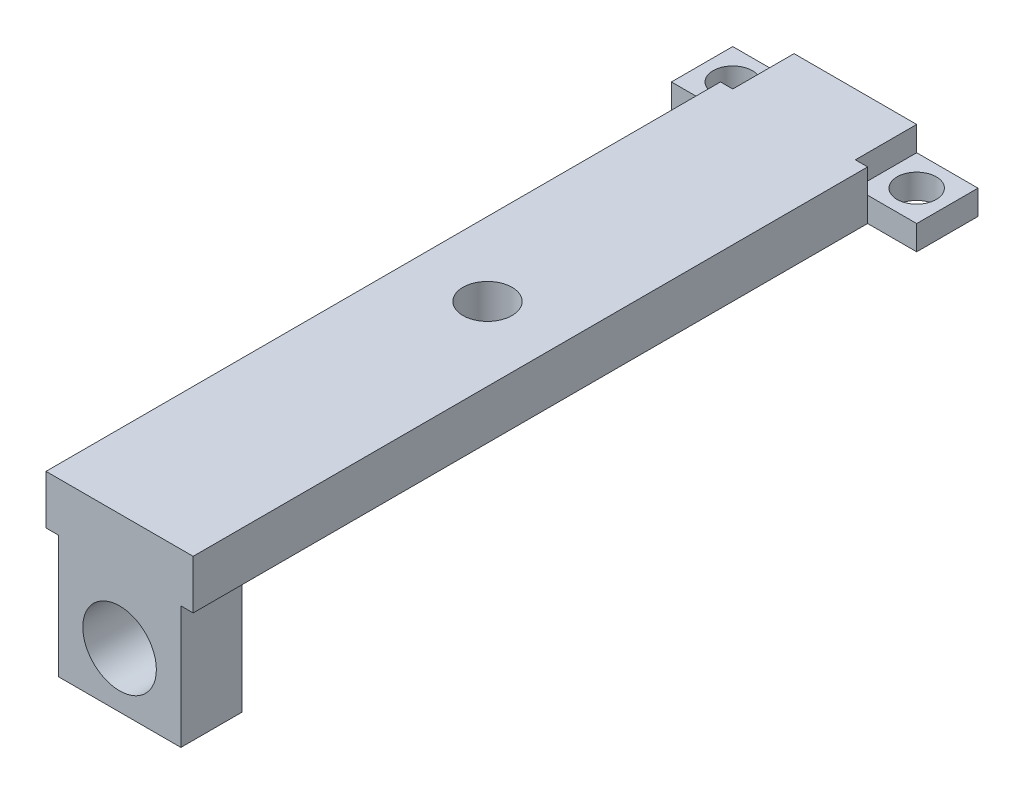
ISO-10303-21;
HEADER;
FILE_DESCRIPTION(('STEP AP214'),'2;1');
FILE_NAME('part.step','',(''),(''),'','','');
FILE_SCHEMA(('AUTOMOTIVE_DESIGN { 1 0 10303 214 1 1 1 1 }'));
ENDSEC;
DATA;
#1=APPLICATION_CONTEXT('core data for automotive mechanical design processes');
#2=APPLICATION_PROTOCOL_DEFINITION('international standard','automotive_design',2000,#1);
#3=PRODUCT_CONTEXT('',#1,'mechanical');
#4=PRODUCT('Part','Part','',(#3));
#5=PRODUCT_RELATED_PRODUCT_CATEGORY('part','',(#4));
#6=PRODUCT_DEFINITION_FORMATION('','',#4);
#7=PRODUCT_DEFINITION_CONTEXT('part definition',#1,'design');
#8=PRODUCT_DEFINITION('design','',#6,#7);
#9=PRODUCT_DEFINITION_SHAPE('','',#8);
#10=(LENGTH_UNIT() NAMED_UNIT(*) SI_UNIT(.MILLI.,.METRE.));
#11=(NAMED_UNIT(*) PLANE_ANGLE_UNIT() SI_UNIT($,.RADIAN.));
#12=(NAMED_UNIT(*) SI_UNIT($,.STERADIAN.) SOLID_ANGLE_UNIT());
#13=UNCERTAINTY_MEASURE_WITH_UNIT(LENGTH_MEASURE(1.E-05),#10,'distance_accuracy_value','');
#14=(GEOMETRIC_REPRESENTATION_CONTEXT(3) GLOBAL_UNCERTAINTY_ASSIGNED_CONTEXT((#13)) GLOBAL_UNIT_ASSIGNED_CONTEXT((#10,
#11,#12)) REPRESENTATION_CONTEXT('',''));
#15=CARTESIAN_POINT('',(0.,0.,0.));
#16=DIRECTION('',(0.,0.,1.));
#17=DIRECTION('',(1.,0.,0.));
#18=AXIS2_PLACEMENT_3D('',#15,#16,#17);
#19=CARTESIAN_POINT('',(-6.,4.,-30.));
#20=DIRECTION('',(1.,0.,0.));
#21=DIRECTION('',(0.,0.,-1.));
#22=AXIS2_PLACEMENT_3D('',#19,#20,#21);
#23=PLANE('',#22);
#24=DIRECTION('',(0.,-1.,0.));
#25=VECTOR('',#24,1.);
#26=CARTESIAN_POINT('',(-6.,4.001,-25.));
#27=LINE('',#26,#25);
#28=CARTESIAN_POINT('',(-6.,4.,-25.));
#29=VERTEX_POINT('',#28);
#30=CARTESIAN_POINT('',(-6.,2.,-25.));
#31=VERTEX_POINT('',#30);
#32=EDGE_CURVE('E190',#29,#31,#27,.T.);
#33=ORIENTED_EDGE('',*,*,#32,.T.);
#34=DIRECTION('',(0.,1.,0.));
#35=VECTOR('',#34,1.);
#36=CARTESIAN_POINT('',(-6.,4.,-25.));
#37=LINE('',#36,#35);
#38=CARTESIAN_POINT('',(-6.,0.,-25.));
#39=VERTEX_POINT('',#38);
#40=EDGE_CURVE('E240',#39,#31,#37,.T.);
#41=ORIENTED_EDGE('',*,*,#40,.F.);
#42=DIRECTION('',(0.,0.,1.));
#43=VECTOR('',#42,1.);
#44=CARTESIAN_POINT('',(-6.,0.,-30.));
#45=LINE('',#44,#43);
#46=CARTESIAN_POINT('',(-6.,0.,30.));
#47=VERTEX_POINT('',#46);
#48=EDGE_CURVE('E279',#39,#47,#45,.T.);
#49=ORIENTED_EDGE('',*,*,#48,.T.);
#50=DIRECTION('',(0.,-1.,0.));
#51=VECTOR('',#50,1.);
#52=CARTESIAN_POINT('',(-6.,4.,30.));
#53=LINE('',#52,#51);
#54=CARTESIAN_POINT('',(-6.,4.,30.));
#55=VERTEX_POINT('',#54);
#56=EDGE_CURVE('E11',#55,#47,#53,.T.);
#57=ORIENTED_EDGE('',*,*,#56,.F.);
#58=DIRECTION('',(0.,0.,1.));
#59=VECTOR('',#58,1.);
#60=CARTESIAN_POINT('',(-6.,4.,-30.));
#61=LINE('',#60,#59);
#62=EDGE_CURVE('E280',#29,#55,#61,.T.);
#63=ORIENTED_EDGE('',*,*,#62,.F.);
#64=EDGE_LOOP('',(#33,#41,#49,#57,#63));
#65=FACE_BOUND('',#64,.T.);
#66=ADVANCED_FACE('F33',(#65),#23,.F.);
#67=CARTESIAN_POINT('',(6.,4.,-30.));
#68=DIRECTION('',(0.,0.,1.));
#69=DIRECTION('',(1.,0.,0.));
#70=AXIS2_PLACEMENT_3D('',#67,#68,#69);
#71=PLANE('',#70);
#72=DIRECTION('',(-1.,0.,0.));
#73=VECTOR('',#72,1.);
#74=CARTESIAN_POINT('',(6.,4.,-30.));
#75=LINE('',#74,#73);
#76=CARTESIAN_POINT('',(5.,4.,-30.));
#77=VERTEX_POINT('',#76);
#78=CARTESIAN_POINT('',(-5.,4.,-30.));
#79=VERTEX_POINT('',#78);
#80=EDGE_CURVE('E179',#77,#79,#75,.T.);
#81=ORIENTED_EDGE('',*,*,#80,.F.);
#82=DIRECTION('',(0.,-1.,0.));
#83=VECTOR('',#82,1.);
#84=CARTESIAN_POINT('',(5.,4.001,-30.));
#85=LINE('',#84,#83);
#86=CARTESIAN_POINT('',(5.,2.,-30.));
#87=VERTEX_POINT('',#86);
#88=EDGE_CURVE('E170',#77,#87,#85,.T.);
#89=ORIENTED_EDGE('',*,*,#88,.T.);
#90=DIRECTION('',(-1.,0.,0.));
#91=VECTOR('',#90,1.);
#92=CARTESIAN_POINT('',(10.,2.,-30.));
#93=LINE('',#92,#91);
#94=CARTESIAN_POINT('',(10.,2.,-30.));
#95=VERTEX_POINT('',#94);
#96=EDGE_CURVE('E154',#95,#87,#93,.T.);
#97=ORIENTED_EDGE('',*,*,#96,.F.);
#98=DIRECTION('',(0.,-1.,0.));
#99=VECTOR('',#98,1.);
#100=CARTESIAN_POINT('',(10.,2.,-30.));
#101=LINE('',#100,#99);
#102=CARTESIAN_POINT('',(10.,0.,-30.));
#103=VERTEX_POINT('',#102);
#104=EDGE_CURVE('E236',#95,#103,#101,.T.);
#105=ORIENTED_EDGE('',*,*,#104,.T.);
#106=DIRECTION('',(-1.,0.,0.));
#107=VECTOR('',#106,1.);
#108=CARTESIAN_POINT('',(6.,0.,-30.));
#109=LINE('',#108,#107);
#110=CARTESIAN_POINT('',(-10.,0.,-30.));
#111=VERTEX_POINT('',#110);
#112=EDGE_CURVE('E283',#103,#111,#109,.T.);
#113=ORIENTED_EDGE('',*,*,#112,.T.);
#114=DIRECTION('',(0.,-1.,0.));
#115=VECTOR('',#114,1.);
#116=CARTESIAN_POINT('',(-10.,2.,-30.));
#117=LINE('',#116,#115);
#118=CARTESIAN_POINT('',(-10.,2.,-30.));
#119=VERTEX_POINT('',#118);
#120=EDGE_CURVE('E233',#119,#111,#117,.T.);
#121=ORIENTED_EDGE('',*,*,#120,.F.);
#122=CARTESIAN_POINT('',(-5.,2.,-30.));
#123=VERTEX_POINT('',#122);
#124=EDGE_CURVE('E165',#123,#119,#93,.T.);
#125=ORIENTED_EDGE('',*,*,#124,.F.);
#126=DIRECTION('',(0.,-1.,0.));
#127=VECTOR('',#126,1.);
#128=CARTESIAN_POINT('',(-5.,4.001,-30.));
#129=LINE('',#128,#127);
#130=EDGE_CURVE('E207',#79,#123,#129,.T.);
#131=ORIENTED_EDGE('',*,*,#130,.F.);
#132=EDGE_LOOP('',(#81,#89,#97,#105,#113,#121,#125,#131));
#133=FACE_BOUND('',#132,.T.);
#134=ADVANCED_FACE('F177',(#133),#71,.F.);
#135=CARTESIAN_POINT('',(0.,4.,0.));
#136=DIRECTION('',(0.,-1.,0.));
#137=DIRECTION('',(0.,0.,-1.));
#138=AXIS2_PLACEMENT_3D('',#135,#136,#137);
#139=PLANE('',#138);
#140=CARTESIAN_POINT('',(0.,4.,0.));
#141=DIRECTION('',(0.,1.,0.));
#142=DIRECTION('',(0.,0.,1.));
#143=AXIS2_PLACEMENT_3D('',#140,#141,#142);
#144=CIRCLE('',#143,2.);
#145=CARTESIAN_POINT('',(0.,4.,2.));
#146=VERTEX_POINT('',#145);
#147=EDGE_CURVE('E434',#146,#146,#144,.T.);
#148=ORIENTED_EDGE('',*,*,#147,.F.);
#149=EDGE_LOOP('',(#148));
#150=FACE_BOUND('',#149,.T.);
#151=DIRECTION('',(1.,0.,0.));
#152=VECTOR('',#151,1.);
#153=CARTESIAN_POINT('',(5.,4.,-25.));
#154=LINE('',#153,#152);
#155=CARTESIAN_POINT('',(5.,4.,-25.));
#156=VERTEX_POINT('',#155);
#157=CARTESIAN_POINT('',(6.,4.,-25.));
#158=VERTEX_POINT('',#157);
#159=EDGE_CURVE('E180',#156,#158,#154,.T.);
#160=ORIENTED_EDGE('',*,*,#159,.F.);
#161=DIRECTION('',(0.,0.,1.));
#162=VECTOR('',#161,1.);
#163=CARTESIAN_POINT('',(5.,4.,-30.));
#164=LINE('',#163,#162);
#165=EDGE_CURVE('E174',#77,#156,#164,.T.);
#166=ORIENTED_EDGE('',*,*,#165,.F.);
#167=ORIENTED_EDGE('',*,*,#80,.T.);
#168=DIRECTION('',(0.,0.,1.));
#169=VECTOR('',#168,1.);
#170=CARTESIAN_POINT('',(-5.,4.,-30.));
#171=LINE('',#170,#169);
#172=CARTESIAN_POINT('',(-5.,4.,-25.));
#173=VERTEX_POINT('',#172);
#174=EDGE_CURVE('E195',#79,#173,#171,.T.);
#175=ORIENTED_EDGE('',*,*,#174,.T.);
#176=DIRECTION('',(-1.,0.,0.));
#177=VECTOR('',#176,1.);
#178=CARTESIAN_POINT('',(-5.,4.,-25.));
#179=LINE('',#178,#177);
#180=EDGE_CURVE('E198',#173,#29,#179,.T.);
#181=ORIENTED_EDGE('',*,*,#180,.T.);
#182=ORIENTED_EDGE('',*,*,#62,.T.);
#183=DIRECTION('',(1.,0.,0.));
#184=VECTOR('',#183,1.);
#185=CARTESIAN_POINT('',(6.,4.,30.));
#186=LINE('',#185,#184);
#187=CARTESIAN_POINT('',(6.,4.,30.));
#188=VERTEX_POINT('',#187);
#189=EDGE_CURVE('E282',#55,#188,#186,.T.);
#190=ORIENTED_EDGE('',*,*,#189,.T.);
#191=DIRECTION('',(0.,0.,-1.));
#192=VECTOR('',#191,1.);
#193=CARTESIAN_POINT('',(6.,4.,-30.));
#194=LINE('',#193,#192);
#195=EDGE_CURVE('E285',#188,#158,#194,.T.);
#196=ORIENTED_EDGE('',*,*,#195,.T.);
#197=EDGE_LOOP('',(#160,#166,#167,#175,#181,#182,#190,#196));
#198=FACE_BOUND('',#197,.T.);
#199=ADVANCED_FACE('F331',(#150,#198),#139,.F.);
#200=CARTESIAN_POINT('',(6.,4.,-30.));
#201=DIRECTION('',(-1.,0.,0.));
#202=DIRECTION('',(0.,0.,1.));
#203=AXIS2_PLACEMENT_3D('',#200,#201,#202);
#204=PLANE('',#203);
#205=DIRECTION('',(0.,-1.,0.));
#206=VECTOR('',#205,1.);
#207=CARTESIAN_POINT('',(6.,4.,-25.));
#208=LINE('',#207,#206);
#209=CARTESIAN_POINT('',(6.,2.,-25.));
#210=VERTEX_POINT('',#209);
#211=CARTESIAN_POINT('',(6.,0.,-25.));
#212=VERTEX_POINT('',#211);
#213=EDGE_CURVE('E238',#210,#212,#208,.T.);
#214=ORIENTED_EDGE('',*,*,#213,.F.);
#215=DIRECTION('',(0.,-1.,0.));
#216=VECTOR('',#215,1.);
#217=CARTESIAN_POINT('',(6.,4.001,-25.));
#218=LINE('',#217,#216);
#219=EDGE_CURVE('E47',#158,#210,#218,.T.);
#220=ORIENTED_EDGE('',*,*,#219,.F.);
#221=ORIENTED_EDGE('',*,*,#195,.F.);
#222=DIRECTION('',(0.,-1.,0.));
#223=VECTOR('',#222,1.);
#224=CARTESIAN_POINT('',(6.,4.,30.));
#225=LINE('',#224,#223);
#226=CARTESIAN_POINT('',(6.,0.,30.));
#227=VERTEX_POINT('',#226);
#228=EDGE_CURVE('E40',#188,#227,#225,.T.);
#229=ORIENTED_EDGE('',*,*,#228,.T.);
#230=DIRECTION('',(0.,0.,-1.));
#231=VECTOR('',#230,1.);
#232=CARTESIAN_POINT('',(6.,0.,-30.));
#233=LINE('',#232,#231);
#234=EDGE_CURVE('E55',#227,#212,#233,.T.);
#235=ORIENTED_EDGE('',*,*,#234,.T.);
#236=EDGE_LOOP('',(#214,#220,#221,#229,#235));
#237=FACE_BOUND('',#236,.T.);
#238=ADVANCED_FACE('F297',(#237),#204,.F.);
#239=CARTESIAN_POINT('',(6.,4.,30.));
#240=DIRECTION('',(0.,0.,-1.));
#241=DIRECTION('',(-1.,0.,0.));
#242=AXIS2_PLACEMENT_3D('',#239,#240,#241);
#243=PLANE('',#242);
#244=CARTESIAN_POINT('',(0.,-5.5,30.));
#245=DIRECTION('',(0.,0.,1.));
#246=DIRECTION('',(1.,0.,0.));
#247=AXIS2_PLACEMENT_3D('',#244,#245,#246);
#248=CIRCLE('',#247,3.);
#249=CARTESIAN_POINT('',(3.,-5.5,30.));
#250=VERTEX_POINT('',#249);
#251=EDGE_CURVE('E243',#250,#250,#248,.T.);
#252=ORIENTED_EDGE('',*,*,#251,.F.);
#253=EDGE_LOOP('',(#252));
#254=FACE_BOUND('',#253,.T.);
#255=DIRECTION('',(1.,0.,0.));
#256=VECTOR('',#255,1.);
#257=CARTESIAN_POINT('',(6.,0.,30.));
#258=LINE('',#257,#256);
#259=CARTESIAN_POINT('',(-5.,0.,30.));
#260=VERTEX_POINT('',#259);
#261=EDGE_CURVE('E291',#47,#260,#258,.T.);
#262=ORIENTED_EDGE('',*,*,#261,.T.);
#263=DIRECTION('',(0.,1.,0.));
#264=VECTOR('',#263,1.);
#265=CARTESIAN_POINT('',(-5.,-10.,30.));
#266=LINE('',#265,#264);
#267=CARTESIAN_POINT('',(-5.,-10.,30.));
#268=VERTEX_POINT('',#267);
#269=EDGE_CURVE('E260',#268,#260,#266,.T.);
#270=ORIENTED_EDGE('',*,*,#269,.F.);
#271=DIRECTION('',(-1.,0.,0.));
#272=VECTOR('',#271,1.);
#273=CARTESIAN_POINT('',(-5.,-10.,30.));
#274=LINE('',#273,#272);
#275=CARTESIAN_POINT('',(5.,-10.,30.));
#276=VERTEX_POINT('',#275);
#277=EDGE_CURVE('E258',#276,#268,#274,.T.);
#278=ORIENTED_EDGE('',*,*,#277,.F.);
#279=DIRECTION('',(0.,1.,0.));
#280=VECTOR('',#279,1.);
#281=CARTESIAN_POINT('',(5.,-10.,30.));
#282=LINE('',#281,#280);
#283=CARTESIAN_POINT('',(5.,0.,30.));
#284=VERTEX_POINT('',#283);
#285=EDGE_CURVE('E270',#276,#284,#282,.T.);
#286=ORIENTED_EDGE('',*,*,#285,.T.);
#287=EDGE_CURVE('E290',#284,#227,#258,.T.);
#288=ORIENTED_EDGE('',*,*,#287,.T.);
#289=ORIENTED_EDGE('',*,*,#228,.F.);
#290=ORIENTED_EDGE('',*,*,#189,.F.);
#291=ORIENTED_EDGE('',*,*,#56,.T.);
#292=EDGE_LOOP('',(#262,#270,#278,#286,#288,#289,#290,#291));
#293=FACE_BOUND('',#292,.T.);
#294=ADVANCED_FACE('F339',(#254,#293),#243,.F.);
#295=CARTESIAN_POINT('',(0.,0.,0.));
#296=DIRECTION('',(0.,-1.,0.));
#297=DIRECTION('',(0.,0.,-1.));
#298=AXIS2_PLACEMENT_3D('',#295,#296,#297);
#299=PLANE('',#298);
#300=CARTESIAN_POINT('',(0.,0.,0.));
#301=DIRECTION('',(0.,-1.,0.));
#302=DIRECTION('',(0.,0.,-1.));
#303=AXIS2_PLACEMENT_3D('',#300,#301,#302);
#304=CIRCLE('',#303,2.);
#305=CARTESIAN_POINT('',(0.,0.,2.));
#306=VERTEX_POINT('',#305);
#307=EDGE_CURVE('E431',#306,#306,#304,.F.);
#308=ORIENTED_EDGE('',*,*,#307,.T.);
#309=EDGE_LOOP('',(#308));
#310=FACE_BOUND('',#309,.T.);
#311=CARTESIAN_POINT('',(7.5,0.,-27.5));
#312=DIRECTION('',(0.,-1.,0.));
#313=DIRECTION('',(0.,0.,-1.));
#314=AXIS2_PLACEMENT_3D('',#311,#312,#313);
#315=CIRCLE('',#314,1.6);
#316=CARTESIAN_POINT('',(7.5,0.,-29.1));
#317=VERTEX_POINT('',#316);
#318=EDGE_CURVE('E334',#317,#317,#315,.T.);
#319=ORIENTED_EDGE('',*,*,#318,.F.);
#320=EDGE_LOOP('',(#319));
#321=FACE_BOUND('',#320,.T.);
#322=CARTESIAN_POINT('',(-7.5,0.,-27.5));
#323=DIRECTION('',(0.,-1.,0.));
#324=DIRECTION('',(0.,0.,-1.));
#325=AXIS2_PLACEMENT_3D('',#322,#323,#324);
#326=CIRCLE('',#325,1.6);
#327=CARTESIAN_POINT('',(-7.5,0.,-29.1));
#328=VERTEX_POINT('',#327);
#329=EDGE_CURVE('E182',#328,#328,#326,.F.);
#330=ORIENTED_EDGE('',*,*,#329,.T.);
#331=EDGE_LOOP('',(#330));
#332=FACE_BOUND('',#331,.T.);
#333=ORIENTED_EDGE('',*,*,#112,.F.);
#334=DIRECTION('',(0.,0.,-1.));
#335=VECTOR('',#334,1.);
#336=CARTESIAN_POINT('',(10.,0.,-25.));
#337=LINE('',#336,#335);
#338=CARTESIAN_POINT('',(10.,0.,-25.));
#339=VERTEX_POINT('',#338);
#340=EDGE_CURVE('E212',#339,#103,#337,.T.);
#341=ORIENTED_EDGE('',*,*,#340,.F.);
#342=DIRECTION('',(1.,0.,0.));
#343=VECTOR('',#342,1.);
#344=CARTESIAN_POINT('',(10.,0.,-25.));
#345=LINE('',#344,#343);
#346=EDGE_CURVE('E225',#212,#339,#345,.T.);
#347=ORIENTED_EDGE('',*,*,#346,.F.);
#348=ORIENTED_EDGE('',*,*,#234,.F.);
#349=ORIENTED_EDGE('',*,*,#287,.F.);
#350=DIRECTION('',(0.,0.,1.));
#351=VECTOR('',#350,1.);
#352=CARTESIAN_POINT('',(5.,0.,30.));
#353=LINE('',#352,#351);
#354=CARTESIAN_POINT('',(5.,0.,25.));
#355=VERTEX_POINT('',#354);
#356=EDGE_CURVE('E254',#355,#284,#353,.T.);
#357=ORIENTED_EDGE('',*,*,#356,.F.);
#358=DIRECTION('',(1.,0.,0.));
#359=VECTOR('',#358,1.);
#360=CARTESIAN_POINT('',(-5.,0.,25.));
#361=LINE('',#360,#359);
#362=CARTESIAN_POINT('',(-5.,0.,25.));
#363=VERTEX_POINT('',#362);
#364=EDGE_CURVE('E263',#363,#355,#361,.T.);
#365=ORIENTED_EDGE('',*,*,#364,.F.);
#366=DIRECTION('',(0.,0.,-1.));
#367=VECTOR('',#366,1.);
#368=CARTESIAN_POINT('',(-5.,0.,30.));
#369=LINE('',#368,#367);
#370=EDGE_CURVE('E249',#260,#363,#369,.T.);
#371=ORIENTED_EDGE('',*,*,#370,.F.);
#372=ORIENTED_EDGE('',*,*,#261,.F.);
#373=ORIENTED_EDGE('',*,*,#48,.F.);
#374=CARTESIAN_POINT('',(-10.,0.,-25.));
#375=VERTEX_POINT('',#374);
#376=EDGE_CURVE('E213',#375,#39,#345,.T.);
#377=ORIENTED_EDGE('',*,*,#376,.F.);
#378=DIRECTION('',(0.,0.,1.));
#379=VECTOR('',#378,1.);
#380=CARTESIAN_POINT('',(-10.,0.,-25.));
#381=LINE('',#380,#379);
#382=EDGE_CURVE('E223',#111,#375,#381,.T.);
#383=ORIENTED_EDGE('',*,*,#382,.F.);
#384=EDGE_LOOP('',(#333,#341,#347,#348,#349,#357,#365,#371,#372,#373,#377,#383));
#385=FACE_BOUND('',#384,.T.);
#386=ADVANCED_FACE('F302',(#310,#321,#332,#385),#299,.T.);
#387=CARTESIAN_POINT('',(-5.,-10.,30.));
#388=DIRECTION('',(1.,0.,0.));
#389=DIRECTION('',(0.,0.,-1.));
#390=AXIS2_PLACEMENT_3D('',#387,#388,#389);
#391=PLANE('',#390);
#392=ORIENTED_EDGE('',*,*,#370,.T.);
#393=DIRECTION('',(0.,1.,0.));
#394=VECTOR('',#393,1.);
#395=CARTESIAN_POINT('',(-5.,-10.,25.));
#396=LINE('',#395,#394);
#397=CARTESIAN_POINT('',(-5.,-10.,25.));
#398=VERTEX_POINT('',#397);
#399=EDGE_CURVE('E276',#398,#363,#396,.T.);
#400=ORIENTED_EDGE('',*,*,#399,.F.);
#401=DIRECTION('',(0.,0.,-1.));
#402=VECTOR('',#401,1.);
#403=CARTESIAN_POINT('',(-5.,-10.,30.));
#404=LINE('',#403,#402);
#405=EDGE_CURVE('E250',#268,#398,#404,.T.);
#406=ORIENTED_EDGE('',*,*,#405,.F.);
#407=ORIENTED_EDGE('',*,*,#269,.T.);
#408=EDGE_LOOP('',(#392,#400,#406,#407));
#409=FACE_BOUND('',#408,.T.);
#410=ADVANCED_FACE('F345',(#409),#391,.F.);
#411=CARTESIAN_POINT('',(-5.,-10.,25.));
#412=DIRECTION('',(0.,0.,1.));
#413=DIRECTION('',(1.,0.,0.));
#414=AXIS2_PLACEMENT_3D('',#411,#412,#413);
#415=PLANE('',#414);
#416=CARTESIAN_POINT('',(0.,-5.5,25.));
#417=DIRECTION('',(0.,0.,1.));
#418=DIRECTION('',(1.,0.,0.));
#419=AXIS2_PLACEMENT_3D('',#416,#417,#418);
#420=CIRCLE('',#419,3.);
#421=CARTESIAN_POINT('',(3.,-5.5,25.));
#422=VERTEX_POINT('',#421);
#423=EDGE_CURVE('E246',#422,#422,#420,.F.);
#424=ORIENTED_EDGE('',*,*,#423,.F.);
#425=EDGE_LOOP('',(#424));
#426=FACE_BOUND('',#425,.T.);
#427=ORIENTED_EDGE('',*,*,#364,.T.);
#428=DIRECTION('',(0.,1.,0.));
#429=VECTOR('',#428,1.);
#430=CARTESIAN_POINT('',(5.,-10.,25.));
#431=LINE('',#430,#429);
#432=CARTESIAN_POINT('',(5.,-10.,25.));
#433=VERTEX_POINT('',#432);
#434=EDGE_CURVE('E273',#433,#355,#431,.T.);
#435=ORIENTED_EDGE('',*,*,#434,.F.);
#436=DIRECTION('',(1.,0.,0.));
#437=VECTOR('',#436,1.);
#438=CARTESIAN_POINT('',(-5.,-10.,25.));
#439=LINE('',#438,#437);
#440=EDGE_CURVE('E253',#398,#433,#439,.T.);
#441=ORIENTED_EDGE('',*,*,#440,.F.);
#442=ORIENTED_EDGE('',*,*,#399,.T.);
#443=EDGE_LOOP('',(#427,#435,#441,#442));
#444=FACE_BOUND('',#443,.T.);
#445=ADVANCED_FACE('F355',(#426,#444),#415,.F.);
#446=CARTESIAN_POINT('',(5.,-10.,30.));
#447=DIRECTION('',(-1.,0.,0.));
#448=DIRECTION('',(0.,0.,1.));
#449=AXIS2_PLACEMENT_3D('',#446,#447,#448);
#450=PLANE('',#449);
#451=ORIENTED_EDGE('',*,*,#356,.T.);
#452=ORIENTED_EDGE('',*,*,#285,.F.);
#453=DIRECTION('',(0.,0.,1.));
#454=VECTOR('',#453,1.);
#455=CARTESIAN_POINT('',(5.,-10.,30.));
#456=LINE('',#455,#454);
#457=EDGE_CURVE('E256',#433,#276,#456,.T.);
#458=ORIENTED_EDGE('',*,*,#457,.F.);
#459=ORIENTED_EDGE('',*,*,#434,.T.);
#460=EDGE_LOOP('',(#451,#452,#458,#459));
#461=FACE_BOUND('',#460,.T.);
#462=ADVANCED_FACE('F353',(#461),#450,.F.);
#463=CARTESIAN_POINT('',(0.,-10.,0.));
#464=DIRECTION('',(0.,-1.,0.));
#465=DIRECTION('',(0.,0.,-1.));
#466=AXIS2_PLACEMENT_3D('',#463,#464,#465);
#467=PLANE('',#466);
#468=ORIENTED_EDGE('',*,*,#405,.T.);
#469=ORIENTED_EDGE('',*,*,#440,.T.);
#470=ORIENTED_EDGE('',*,*,#457,.T.);
#471=ORIENTED_EDGE('',*,*,#277,.T.);
#472=EDGE_LOOP('',(#468,#469,#470,#471));
#473=FACE_BOUND('',#472,.T.);
#474=ADVANCED_FACE('F348',(#473),#467,.T.);
#475=CARTESIAN_POINT('',(0.,-5.5,-30.001));
#476=DIRECTION('',(0.,0.,1.));
#477=DIRECTION('',(1.,0.,0.));
#478=AXIS2_PLACEMENT_3D('',#475,#476,#477);
#479=CYLINDRICAL_SURFACE('',#478,3.);
#480=ORIENTED_EDGE('',*,*,#251,.T.);
#481=EDGE_LOOP('',(#480));
#482=FACE_BOUND('',#481,.T.);
#483=ORIENTED_EDGE('',*,*,#423,.T.);
#484=EDGE_LOOP('',(#483));
#485=FACE_BOUND('',#484,.T.);
#486=ADVANCED_FACE('F387',(#482,#485),#479,.F.);
#487=CARTESIAN_POINT('',(10.,2.,-25.));
#488=DIRECTION('',(-1.,0.,0.));
#489=DIRECTION('',(0.,0.,1.));
#490=AXIS2_PLACEMENT_3D('',#487,#488,#489);
#491=PLANE('',#490);
#492=ORIENTED_EDGE('',*,*,#340,.T.);
#493=ORIENTED_EDGE('',*,*,#104,.F.);
#494=DIRECTION('',(0.,0.,-1.));
#495=VECTOR('',#494,1.);
#496=CARTESIAN_POINT('',(10.,2.,-25.));
#497=LINE('',#496,#495);
#498=CARTESIAN_POINT('',(10.,2.,-25.));
#499=VERTEX_POINT('',#498);
#500=EDGE_CURVE('E159',#499,#95,#497,.T.);
#501=ORIENTED_EDGE('',*,*,#500,.F.);
#502=DIRECTION('',(0.,-1.,0.));
#503=VECTOR('',#502,1.);
#504=CARTESIAN_POINT('',(10.,2.,-25.));
#505=LINE('',#504,#503);
#506=EDGE_CURVE('E220',#499,#339,#505,.T.);
#507=ORIENTED_EDGE('',*,*,#506,.T.);
#508=EDGE_LOOP('',(#492,#493,#501,#507));
#509=FACE_BOUND('',#508,.T.);
#510=ADVANCED_FACE('F309',(#509),#491,.F.);
#511=CARTESIAN_POINT('',(0.,2.,0.));
#512=DIRECTION('',(0.,1.,0.));
#513=DIRECTION('',(0.,0.,1.));
#514=AXIS2_PLACEMENT_3D('',#511,#512,#513);
#515=PLANE('',#514);
#516=CARTESIAN_POINT('',(7.5,2.,-27.5));
#517=DIRECTION('',(0.,-1.,0.));
#518=DIRECTION('',(0.,0.,1.));
#519=AXIS2_PLACEMENT_3D('',#516,#517,#518);
#520=CIRCLE('',#519,1.6);
#521=CARTESIAN_POINT('',(7.5,2.,-25.9));
#522=VERTEX_POINT('',#521);
#523=EDGE_CURVE('E435',#522,#522,#520,.T.);
#524=ORIENTED_EDGE('',*,*,#523,.T.);
#525=EDGE_LOOP('',(#524));
#526=FACE_BOUND('',#525,.T.);
#527=ORIENTED_EDGE('',*,*,#96,.T.);
#528=DIRECTION('',(0.,0.,-1.));
#529=VECTOR('',#528,1.);
#530=CARTESIAN_POINT('',(5.,2.,-30.));
#531=LINE('',#530,#529);
#532=CARTESIAN_POINT('',(5.,2.,-25.));
#533=VERTEX_POINT('',#532);
#534=EDGE_CURVE('E157',#533,#87,#531,.T.);
#535=ORIENTED_EDGE('',*,*,#534,.F.);
#536=DIRECTION('',(-1.,0.,0.));
#537=VECTOR('',#536,1.);
#538=CARTESIAN_POINT('',(5.,2.,-25.));
#539=LINE('',#538,#537);
#540=EDGE_CURVE('E173',#210,#533,#539,.T.);
#541=ORIENTED_EDGE('',*,*,#540,.F.);
#542=DIRECTION('',(1.,0.,0.));
#543=VECTOR('',#542,1.);
#544=CARTESIAN_POINT('',(10.,2.,-25.));
#545=LINE('',#544,#543);
#546=EDGE_CURVE('E216',#210,#499,#545,.T.);
#547=ORIENTED_EDGE('',*,*,#546,.T.);
#548=ORIENTED_EDGE('',*,*,#500,.T.);
#549=EDGE_LOOP('',(#527,#535,#541,#547,#548));
#550=FACE_BOUND('',#549,.T.);
#551=ADVANCED_FACE('F156',(#526,#550),#515,.T.);
#552=CARTESIAN_POINT('',(10.,2.,-25.));
#553=DIRECTION('',(0.,0.,-1.));
#554=DIRECTION('',(-1.,0.,0.));
#555=AXIS2_PLACEMENT_3D('',#552,#553,#554);
#556=PLANE('',#555);
#557=ORIENTED_EDGE('',*,*,#546,.F.);
#558=ORIENTED_EDGE('',*,*,#213,.T.);
#559=ORIENTED_EDGE('',*,*,#346,.T.);
#560=ORIENTED_EDGE('',*,*,#506,.F.);
#561=EDGE_LOOP('',(#557,#558,#559,#560));
#562=FACE_BOUND('',#561,.T.);
#563=ADVANCED_FACE('F307',(#562),#556,.F.);
#564=CARTESIAN_POINT('',(-7.5,2.,-27.5));
#565=DIRECTION('',(0.,1.,0.));
#566=DIRECTION('',(0.,0.,1.));
#567=AXIS2_PLACEMENT_3D('',#564,#565,#566);
#568=CIRCLE('',#567,1.6);
#569=CARTESIAN_POINT('',(-7.5,2.,-25.9));
#570=VERTEX_POINT('',#569);
#571=EDGE_CURVE('E187',#570,#570,#568,.T.);
#572=ORIENTED_EDGE('',*,*,#571,.F.);
#573=EDGE_LOOP('',(#572));
#574=FACE_BOUND('',#573,.T.);
#575=CARTESIAN_POINT('',(-10.,2.,-25.));
#576=VERTEX_POINT('',#575);
#577=EDGE_CURVE('E217',#576,#31,#545,.T.);
#578=ORIENTED_EDGE('',*,*,#577,.T.);
#579=DIRECTION('',(1.,0.,0.));
#580=VECTOR('',#579,1.);
#581=CARTESIAN_POINT('',(-5.,2.,-25.));
#582=LINE('',#581,#580);
#583=CARTESIAN_POINT('',(-5.,2.,-25.));
#584=VERTEX_POINT('',#583);
#585=EDGE_CURVE('E201',#31,#584,#582,.T.);
#586=ORIENTED_EDGE('',*,*,#585,.T.);
#587=DIRECTION('',(0.,0.,-1.));
#588=VECTOR('',#587,1.);
#589=CARTESIAN_POINT('',(-5.,2.,-30.));
#590=LINE('',#589,#588);
#591=EDGE_CURVE('E204',#584,#123,#590,.T.);
#592=ORIENTED_EDGE('',*,*,#591,.T.);
#593=ORIENTED_EDGE('',*,*,#124,.T.);
#594=DIRECTION('',(0.,0.,1.));
#595=VECTOR('',#594,1.);
#596=CARTESIAN_POINT('',(-10.,2.,-25.));
#597=LINE('',#596,#595);
#598=EDGE_CURVE('E164',#119,#576,#597,.T.);
#599=ORIENTED_EDGE('',*,*,#598,.T.);
#600=EDGE_LOOP('',(#578,#586,#592,#593,#599));
#601=FACE_BOUND('',#600,.T.);
#602=ADVANCED_FACE('F323',(#574,#601),#515,.T.);
#603=ORIENTED_EDGE('',*,*,#376,.T.);
#604=ORIENTED_EDGE('',*,*,#40,.T.);
#605=ORIENTED_EDGE('',*,*,#577,.F.);
#606=DIRECTION('',(0.,-1.,0.));
#607=VECTOR('',#606,1.);
#608=CARTESIAN_POINT('',(-10.,2.,-25.));
#609=LINE('',#608,#607);
#610=EDGE_CURVE('E230',#576,#375,#609,.T.);
#611=ORIENTED_EDGE('',*,*,#610,.T.);
#612=EDGE_LOOP('',(#603,#604,#605,#611));
#613=FACE_BOUND('',#612,.T.);
#614=ADVANCED_FACE('F320',(#613),#556,.F.);
#615=CARTESIAN_POINT('',(-10.,2.,-25.));
#616=DIRECTION('',(1.,0.,0.));
#617=DIRECTION('',(0.,0.,-1.));
#618=AXIS2_PLACEMENT_3D('',#615,#616,#617);
#619=PLANE('',#618);
#620=ORIENTED_EDGE('',*,*,#382,.T.);
#621=ORIENTED_EDGE('',*,*,#610,.F.);
#622=ORIENTED_EDGE('',*,*,#598,.F.);
#623=ORIENTED_EDGE('',*,*,#120,.T.);
#624=EDGE_LOOP('',(#620,#621,#622,#623));
#625=FACE_BOUND('',#624,.T.);
#626=ADVANCED_FACE('F314',(#625),#619,.F.);
#627=CARTESIAN_POINT('',(-5.,4.001,-25.));
#628=DIRECTION('',(0.,0.,-1.));
#629=DIRECTION('',(-1.,0.,0.));
#630=AXIS2_PLACEMENT_3D('',#627,#628,#629);
#631=PLANE('',#630);
#632=ORIENTED_EDGE('',*,*,#180,.F.);
#633=DIRECTION('',(0.,-1.,0.));
#634=VECTOR('',#633,1.);
#635=CARTESIAN_POINT('',(-5.,4.001,-25.));
#636=LINE('',#635,#634);
#637=EDGE_CURVE('E210',#173,#584,#636,.T.);
#638=ORIENTED_EDGE('',*,*,#637,.T.);
#639=ORIENTED_EDGE('',*,*,#585,.F.);
#640=ORIENTED_EDGE('',*,*,#32,.F.);
#641=EDGE_LOOP('',(#632,#638,#639,#640));
#642=FACE_BOUND('',#641,.T.);
#643=ADVANCED_FACE('F400',(#642),#631,.T.);
#644=CARTESIAN_POINT('',(-5.,4.001,-30.));
#645=DIRECTION('',(-1.,0.,0.));
#646=DIRECTION('',(0.,0.,1.));
#647=AXIS2_PLACEMENT_3D('',#644,#645,#646);
#648=PLANE('',#647);
#649=ORIENTED_EDGE('',*,*,#130,.T.);
#650=ORIENTED_EDGE('',*,*,#591,.F.);
#651=ORIENTED_EDGE('',*,*,#637,.F.);
#652=ORIENTED_EDGE('',*,*,#174,.F.);
#653=EDGE_LOOP('',(#649,#650,#651,#652));
#654=FACE_BOUND('',#653,.T.);
#655=ADVANCED_FACE('F327',(#654),#648,.T.);
#656=CARTESIAN_POINT('',(-7.5,-10.001,-27.5));
#657=DIRECTION('',(0.,1.,0.));
#658=DIRECTION('',(0.,0.,1.));
#659=AXIS2_PLACEMENT_3D('',#656,#657,#658);
#660=CYLINDRICAL_SURFACE('',#659,1.6);
#661=ORIENTED_EDGE('',*,*,#329,.F.);
#662=EDGE_LOOP('',(#661));
#663=FACE_BOUND('',#662,.T.);
#664=ORIENTED_EDGE('',*,*,#571,.T.);
#665=EDGE_LOOP('',(#664));
#666=FACE_BOUND('',#665,.T.);
#667=ADVANCED_FACE('F411',(#663,#666),#660,.F.);
#668=CARTESIAN_POINT('',(5.,4.001,-30.));
#669=DIRECTION('',(-1.,0.,0.));
#670=DIRECTION('',(0.,0.,1.));
#671=AXIS2_PLACEMENT_3D('',#668,#669,#670);
#672=PLANE('',#671);
#673=ORIENTED_EDGE('',*,*,#165,.T.);
#674=DIRECTION('',(0.,-1.,0.));
#675=VECTOR('',#674,1.);
#676=CARTESIAN_POINT('',(5.,4.001,-25.));
#677=LINE('',#676,#675);
#678=EDGE_CURVE('E172',#156,#533,#677,.T.);
#679=ORIENTED_EDGE('',*,*,#678,.T.);
#680=ORIENTED_EDGE('',*,*,#534,.T.);
#681=ORIENTED_EDGE('',*,*,#88,.F.);
#682=EDGE_LOOP('',(#673,#679,#680,#681));
#683=FACE_BOUND('',#682,.T.);
#684=ADVANCED_FACE('F169',(#683),#672,.F.);
#685=CARTESIAN_POINT('',(5.,4.001,-25.));
#686=DIRECTION('',(0.,0.,1.));
#687=DIRECTION('',(1.,0.,0.));
#688=AXIS2_PLACEMENT_3D('',#685,#686,#687);
#689=PLANE('',#688);
#690=ORIENTED_EDGE('',*,*,#159,.T.);
#691=ORIENTED_EDGE('',*,*,#219,.T.);
#692=ORIENTED_EDGE('',*,*,#540,.T.);
#693=ORIENTED_EDGE('',*,*,#678,.F.);
#694=EDGE_LOOP('',(#690,#691,#692,#693));
#695=FACE_BOUND('',#694,.T.);
#696=ADVANCED_FACE('F337',(#695),#689,.F.);
#697=CARTESIAN_POINT('',(7.5,-10.001,-27.5));
#698=DIRECTION('',(0.,1.,0.));
#699=DIRECTION('',(0.,0.,1.));
#700=AXIS2_PLACEMENT_3D('',#697,#698,#699);
#701=CYLINDRICAL_SURFACE('',#700,1.6);
#702=ORIENTED_EDGE('',*,*,#318,.T.);
#703=EDGE_LOOP('',(#702));
#704=FACE_BOUND('',#703,.T.);
#705=ORIENTED_EDGE('',*,*,#523,.F.);
#706=EDGE_LOOP('',(#705));
#707=FACE_BOUND('',#706,.T.);
#708=ADVANCED_FACE('F419',(#704,#707),#701,.F.);
#709=CARTESIAN_POINT('',(0.,-10.001,0.));
#710=DIRECTION('',(0.,1.,0.));
#711=DIRECTION('',(0.,0.,1.));
#712=AXIS2_PLACEMENT_3D('',#709,#710,#711);
#713=CYLINDRICAL_SURFACE('',#712,2.);
#714=CARTESIAN_POINT('',(0.,0.,2.));
#715=CARTESIAN_POINT('',(0.,0.0416666666666684,2.));
#716=CARTESIAN_POINT('',(0.,0.0833333333333351,2.));
#717=CARTESIAN_POINT('',(0.,0.166666666666669,2.));
#718=CARTESIAN_POINT('',(0.,0.208333333333335,2.));
#719=CARTESIAN_POINT('',(0.,0.291666666666669,2.));
#720=CARTESIAN_POINT('',(0.,0.333333333333335,2.));
#721=CARTESIAN_POINT('',(0.,0.416666666666669,2.));
#722=CARTESIAN_POINT('',(0.,0.458333333333335,2.));
#723=CARTESIAN_POINT('',(0.,0.541666666666668,2.));
#724=CARTESIAN_POINT('',(0.,0.583333333333334,2.));
#725=CARTESIAN_POINT('',(0.,0.666666666666667,2.));
#726=CARTESIAN_POINT('',(0.,0.708333333333334,2.));
#727=CARTESIAN_POINT('',(0.,0.791666666666667,2.));
#728=CARTESIAN_POINT('',(0.,0.833333333333334,2.));
#729=CARTESIAN_POINT('',(0.,0.916666666666668,2.));
#730=CARTESIAN_POINT('',(0.,0.958333333333334,2.));
#731=CARTESIAN_POINT('',(0.,1.04166666666667,2.));
#732=CARTESIAN_POINT('',(0.,1.08333333333333,2.));
#733=CARTESIAN_POINT('',(0.,1.16666666666667,2.));
#734=CARTESIAN_POINT('',(0.,1.20833333333333,2.));
#735=CARTESIAN_POINT('',(0.,1.29166666666667,2.));
#736=CARTESIAN_POINT('',(0.,1.33333333333333,2.));
#737=CARTESIAN_POINT('',(0.,1.41666666666667,2.));
#738=CARTESIAN_POINT('',(0.,1.45833333333333,2.));
#739=CARTESIAN_POINT('',(0.,1.54166666666667,2.));
#740=CARTESIAN_POINT('',(0.,1.58333333333333,2.));
#741=CARTESIAN_POINT('',(0.,1.66666666666667,2.));
#742=CARTESIAN_POINT('',(0.,1.70833333333333,2.));
#743=CARTESIAN_POINT('',(0.,1.79166666666667,2.));
#744=CARTESIAN_POINT('',(0.,1.83333333333333,2.));
#745=CARTESIAN_POINT('',(0.,1.91666666666667,2.));
#746=CARTESIAN_POINT('',(0.,1.95833333333333,2.));
#747=CARTESIAN_POINT('',(0.,2.04166666666667,2.));
#748=CARTESIAN_POINT('',(0.,2.08333333333333,2.));
#749=CARTESIAN_POINT('',(0.,2.16666666666667,2.));
#750=CARTESIAN_POINT('',(0.,2.20833333333333,2.));
#751=CARTESIAN_POINT('',(0.,2.29166666666667,2.));
#752=CARTESIAN_POINT('',(0.,2.33333333333333,2.));
#753=CARTESIAN_POINT('',(0.,2.41666666666667,2.));
#754=CARTESIAN_POINT('',(0.,2.45833333333333,2.));
#755=CARTESIAN_POINT('',(0.,2.54166666666667,2.));
#756=CARTESIAN_POINT('',(0.,2.58333333333333,2.));
#757=CARTESIAN_POINT('',(0.,2.66666666666667,2.));
#758=CARTESIAN_POINT('',(0.,2.70833333333333,2.));
#759=CARTESIAN_POINT('',(0.,2.79166666666667,2.));
#760=CARTESIAN_POINT('',(0.,2.83333333333333,2.));
#761=CARTESIAN_POINT('',(0.,2.91666666666667,2.));
#762=CARTESIAN_POINT('',(0.,2.95833333333333,2.));
#763=CARTESIAN_POINT('',(0.,3.04166666666667,2.));
#764=CARTESIAN_POINT('',(0.,3.08333333333333,2.));
#765=CARTESIAN_POINT('',(0.,3.16666666666667,2.));
#766=CARTESIAN_POINT('',(0.,3.20833333333333,2.));
#767=CARTESIAN_POINT('',(0.,3.29166666666667,2.));
#768=CARTESIAN_POINT('',(0.,3.33333333333333,2.));
#769=CARTESIAN_POINT('',(0.,3.41666666666666,2.));
#770=CARTESIAN_POINT('',(0.,3.45833333333333,2.));
#771=CARTESIAN_POINT('',(0.,3.54166666666666,2.));
#772=CARTESIAN_POINT('',(0.,3.58333333333333,2.));
#773=CARTESIAN_POINT('',(0.,3.66666666666666,2.));
#774=CARTESIAN_POINT('',(0.,3.70833333333333,2.));
#775=CARTESIAN_POINT('',(0.,3.79166666666667,2.));
#776=CARTESIAN_POINT('',(0.,3.83333333333333,2.));
#777=CARTESIAN_POINT('',(0.,3.91666666666666,2.));
#778=CARTESIAN_POINT('',(0.,3.95833333333333,2.));
#779=CARTESIAN_POINT('',(0.,4.,2.));
#780=B_SPLINE_CURVE_WITH_KNOTS('',3,(#714,#715,#716,#717,#718,#719,#720,#721,#722,#723,#724,
#725,#726,#727,#728,#729,#730,#731,#732,#733,#734,#735,#736,#737,#738,#739,#740,#741,#742,#743,
#744,#745,#746,#747,#748,#749,#750,#751,#752,#753,#754,#755,#756,#757,#758,#759,#760,#761,#762,
#763,#764,#765,#766,#767,#768,#769,#770,#771,#772,#773,#774,#775,#776,#777,#778,#779),
.UNSPECIFIED.,.F.,.F.,(4,2,2,2,2,2,2,2,2,2,2,2,2,2,2,2,2,2,2,2,2,2,2,2,2,2,2,2,2,2,2,2,4),(0.,
0.125,0.25,0.375,0.5,0.624999999999999,0.749999999999999,0.874999999999999,0.999999999999999,
1.125,1.25,1.375,1.5,1.625,1.75,1.875,2.,2.125,2.25,2.375,2.5,2.625,2.75,2.875,3.,3.125,3.25,
3.375,3.5,3.625,3.75,3.875,4.),.UNSPECIFIED.);
#781=EDGE_CURVE('BSEAM422',#306,#146,#780,.T.);
#782=ORIENTED_EDGE('',*,*,#307,.F.);
#783=ORIENTED_EDGE('',*,*,#147,.T.);
#784=ORIENTED_EDGE('',*,*,#781,.T.);
#785=ORIENTED_EDGE('',*,*,#781,.F.);
#786=EDGE_LOOP('',(#782,#784,#783,#785));
#787=FACE_BOUND('',#786,.T.);
#788=ADVANCED_FACE('F422',(#787),#713,.F.);
#789=CLOSED_SHELL('',(#66,#134,#199,#238,#294,#386,#410,#445,#462,#474,#486,#510,#551,#563,#602,
#614,#626,#643,#655,#667,#684,#696,#708,#788));
#790=MANIFOLD_SOLID_BREP('B2',#789);
#791=ADVANCED_BREP_SHAPE_REPRESENTATION('',(#18,#790),#14);
#792=SHAPE_DEFINITION_REPRESENTATION(#9,#791);
ENDSEC;
END-ISO-10303-21;
